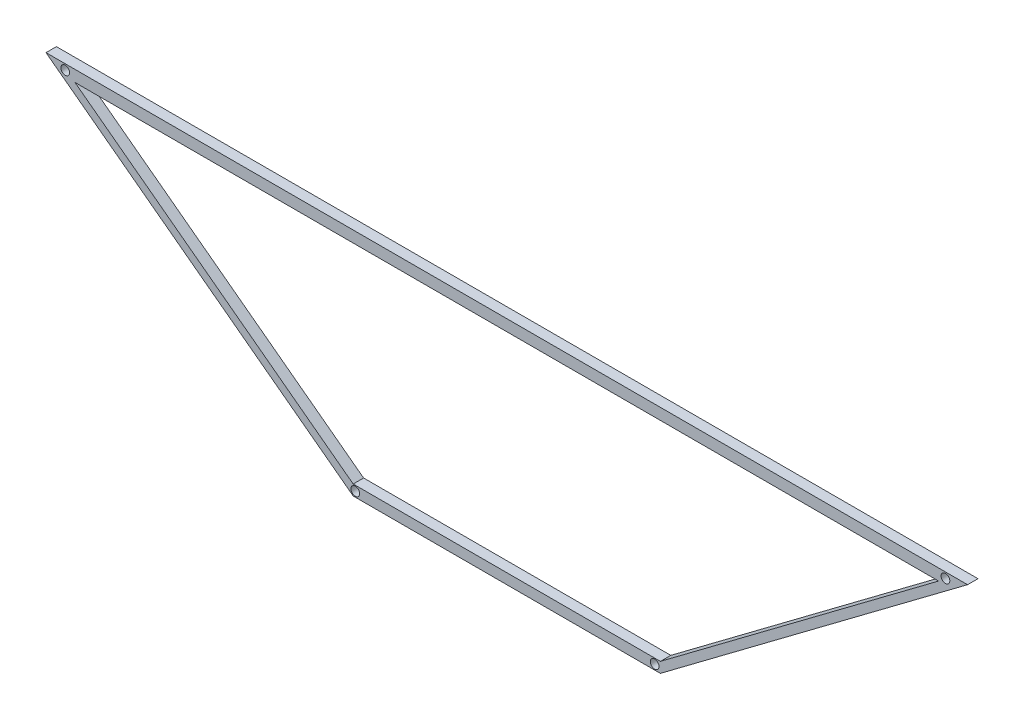
ISO-10303-21;
HEADER;
FILE_DESCRIPTION(('STEP AP214'),'2;1');
FILE_NAME('part.step','',(''),(''),'','','');
FILE_SCHEMA(('AUTOMOTIVE_DESIGN { 1 0 10303 214 1 1 1 1 }'));
ENDSEC;
DATA;
#1=APPLICATION_CONTEXT('core data for automotive mechanical design processes');
#2=APPLICATION_PROTOCOL_DEFINITION('international standard','automotive_design',2000,#1);
#3=PRODUCT_CONTEXT('',#1,'mechanical');
#4=PRODUCT('Part','Part','',(#3));
#5=PRODUCT_RELATED_PRODUCT_CATEGORY('part','',(#4));
#6=PRODUCT_DEFINITION_FORMATION('','',#4);
#7=PRODUCT_DEFINITION_CONTEXT('part definition',#1,'design');
#8=PRODUCT_DEFINITION('design','',#6,#7);
#9=PRODUCT_DEFINITION_SHAPE('','',#8);
#10=(LENGTH_UNIT() NAMED_UNIT(*) SI_UNIT(.MILLI.,.METRE.));
#11=(NAMED_UNIT(*) PLANE_ANGLE_UNIT() SI_UNIT($,.RADIAN.));
#12=(NAMED_UNIT(*) SI_UNIT($,.STERADIAN.) SOLID_ANGLE_UNIT());
#13=UNCERTAINTY_MEASURE_WITH_UNIT(LENGTH_MEASURE(1.E-05),#10,'distance_accuracy_value','');
#14=(GEOMETRIC_REPRESENTATION_CONTEXT(3) GLOBAL_UNCERTAINTY_ASSIGNED_CONTEXT((#13)) GLOBAL_UNIT_ASSIGNED_CONTEXT((#10,
#11,#12)) REPRESENTATION_CONTEXT('',''));
#15=CARTESIAN_POINT('',(0.,0.,0.));
#16=DIRECTION('',(0.,0.,1.));
#17=DIRECTION('',(1.,0.,0.));
#18=AXIS2_PLACEMENT_3D('',#15,#16,#17);
#19=CARTESIAN_POINT('',(0.,0.,13.56));
#20=DIRECTION('',(0.,0.,-1.));
#21=DIRECTION('',(-1.,0.,0.));
#22=AXIS2_PLACEMENT_3D('',#19,#20,#21);
#23=PLANE('',#22);
#24=CARTESIAN_POINT('',(945.339868666451,62.77782,13.56));
#25=DIRECTION('',(0.,0.,1.));
#26=DIRECTION('',(1.,0.,0.));
#27=AXIS2_PLACEMENT_3D('',#24,#25,#26);
#28=CIRCLE('',#27,5.70000000000006);
#29=CARTESIAN_POINT('',(951.039868666451,62.77782,13.56));
#30=VERTEX_POINT('',#29);
#31=EDGE_CURVE('E272',#30,#30,#28,.T.);
#32=ORIENTED_EDGE('',*,*,#31,.F.);
#33=EDGE_LOOP('',(#32));
#34=FACE_BOUND('',#33,.T.);
#35=CARTESIAN_POINT('',(-200.789433703648,62.77782,13.56));
#36=DIRECTION('',(0.,0.,1.));
#37=DIRECTION('',(1.,0.,0.));
#38=AXIS2_PLACEMENT_3D('',#35,#36,#37);
#39=CIRCLE('',#38,5.7);
#40=CARTESIAN_POINT('',(-195.089433703648,62.77782,13.56));
#41=VERTEX_POINT('',#40);
#42=EDGE_CURVE('E274',#41,#41,#39,.T.);
#43=ORIENTED_EDGE('',*,*,#42,.F.);
#44=EDGE_LOOP('',(#43));
#45=FACE_BOUND('',#44,.T.);
#46=CARTESIAN_POINT('',(176.919160889639,-223.073008715588,13.56));
#47=DIRECTION('',(0.,0.,1.));
#48=DIRECTION('',(1.,0.,0.));
#49=AXIS2_PLACEMENT_3D('',#46,#47,#48);
#50=CIRCLE('',#49,5.70000000000001);
#51=CARTESIAN_POINT('',(182.619160889639,-223.073008715588,13.56));
#52=VERTEX_POINT('',#51);
#53=EDGE_CURVE('E289',#52,#52,#50,.T.);
#54=ORIENTED_EDGE('',*,*,#53,.F.);
#55=EDGE_LOOP('',(#54));
#56=FACE_BOUND('',#55,.T.);
#57=CARTESIAN_POINT('',(566.674885296607,-223.073008715588,13.56));
#58=DIRECTION('',(0.,0.,1.));
#59=DIRECTION('',(1.,0.,0.));
#60=AXIS2_PLACEMENT_3D('',#57,#58,#59);
#61=CIRCLE('',#60,5.70000000000006);
#62=CARTESIAN_POINT('',(572.374885296607,-223.073008715588,13.56));
#63=VERTEX_POINT('',#62);
#64=EDGE_CURVE('E293',#63,#63,#61,.T.);
#65=ORIENTED_EDGE('',*,*,#64,.F.);
#66=EDGE_LOOP('',(#65));
#67=FACE_BOUND('',#66,.T.);
#68=DIRECTION('',(0.8,-0.6,0.));
#69=VECTOR('',#68,1.);
#70=CARTESIAN_POINT('',(-225.816062759579,70.095146263553,13.56));
#71=LINE('',#70,#69);
#72=CARTESIAN_POINT('',(-225.816062759579,70.095146263553,13.56));
#73=VERTEX_POINT('',#72);
#74=CARTESIAN_POINT('',(174.183937240421,-229.904853736447,13.56));
#75=VERTEX_POINT('',#74);
#76=EDGE_CURVE('E161',#73,#75,#71,.T.);
#77=ORIENTED_EDGE('',*,*,#76,.T.);
#78=DIRECTION('',(1.,0.,0.));
#79=VECTOR('',#78,1.);
#80=CARTESIAN_POINT('',(174.183937240421,-229.904853736447,13.56));
#81=LINE('',#80,#79);
#82=CARTESIAN_POINT('',(574.183937240421,-229.904853736447,13.56));
#83=VERTEX_POINT('',#82);
#84=EDGE_CURVE('E164',#75,#83,#81,.T.);
#85=ORIENTED_EDGE('',*,*,#84,.T.);
#86=DIRECTION('',(0.8,0.6,0.));
#87=VECTOR('',#86,1.);
#88=CARTESIAN_POINT('',(974.183937240421,70.095146263553,13.56));
#89=LINE('',#88,#87);
#90=CARTESIAN_POINT('',(974.183937240421,70.095146263553,13.56));
#91=VERTEX_POINT('',#90);
#92=EDGE_CURVE('E166',#83,#91,#89,.T.);
#93=ORIENTED_EDGE('',*,*,#92,.T.);
#94=DIRECTION('',(-1.,0.,0.));
#95=VECTOR('',#94,1.);
#96=CARTESIAN_POINT('',(-225.816062759579,70.095146263553,13.56));
#97=LINE('',#96,#95);
#98=EDGE_CURVE('E171',#91,#73,#97,.T.);
#99=ORIENTED_EDGE('',*,*,#98,.T.);
#100=EDGE_LOOP('',(#77,#85,#93,#99));
#101=FACE_BOUND('',#100,.T.);
#102=DIRECTION('',(-1.,0.,0.));
#103=VECTOR('',#102,1.);
#104=CARTESIAN_POINT('',(936.447387253727,55.3527337735328,13.56));
#105=LINE('',#104,#103);
#106=CARTESIAN_POINT('',(936.447387253727,55.3527337735328,13.56));
#107=VERTEX_POINT('',#106);
#108=CARTESIAN_POINT('',(-188.079512772886,55.3527337735327,13.56));
#109=VERTEX_POINT('',#108);
#110=EDGE_CURVE('E112',#107,#109,#105,.T.);
#111=ORIENTED_EDGE('',*,*,#110,.F.);
#112=DIRECTION('',(0.8,0.6,0.));
#113=VECTOR('',#112,1.);
#114=CARTESIAN_POINT('',(574.183937240421,-216.344853736447,13.56));
#115=LINE('',#114,#113);
#116=CARTESIAN_POINT('',(574.183937240421,-216.344853736447,13.56));
#117=VERTEX_POINT('',#116);
#118=EDGE_CURVE('E139',#117,#107,#115,.T.);
#119=ORIENTED_EDGE('',*,*,#118,.F.);
#120=DIRECTION('',(1.,0.,0.));
#121=VECTOR('',#120,1.);
#122=CARTESIAN_POINT('',(174.183937240421,-216.344853736447,13.56));
#123=LINE('',#122,#121);
#124=CARTESIAN_POINT('',(174.183937240421,-216.344853736447,13.56));
#125=VERTEX_POINT('',#124);
#126=EDGE_CURVE('E134',#125,#117,#123,.T.);
#127=ORIENTED_EDGE('',*,*,#126,.F.);
#128=DIRECTION('',(0.8,-0.6,0.));
#129=VECTOR('',#128,1.);
#130=CARTESIAN_POINT('',(174.183937240421,-216.344853736447,13.56));
#131=LINE('',#130,#129);
#132=EDGE_CURVE('E117',#109,#125,#131,.T.);
#133=ORIENTED_EDGE('',*,*,#132,.F.);
#134=EDGE_LOOP('',(#111,#119,#127,#133));
#135=FACE_BOUND('',#134,.T.);
#136=ADVANCED_FACE('F44',(#34,#45,#56,#67,#101,#135),#23,.F.);
#137=CARTESIAN_POINT('',(0.,0.,0.));
#138=DIRECTION('',(0.,0.,-1.));
#139=DIRECTION('',(-1.,0.,0.));
#140=AXIS2_PLACEMENT_3D('',#137,#138,#139);
#141=PLANE('',#140);
#142=CARTESIAN_POINT('',(945.339868666451,62.77782,0.));
#143=DIRECTION('',(0.,0.,1.));
#144=DIRECTION('',(1.,0.,0.));
#145=AXIS2_PLACEMENT_3D('',#142,#143,#144);
#146=CIRCLE('',#145,5.70000000000006);
#147=CARTESIAN_POINT('',(951.039868666451,62.77782,0.));
#148=VERTEX_POINT('',#147);
#149=EDGE_CURVE('E144',#148,#148,#146,.T.);
#150=ORIENTED_EDGE('',*,*,#149,.T.);
#151=EDGE_LOOP('',(#150));
#152=FACE_BOUND('',#151,.T.);
#153=CARTESIAN_POINT('',(-200.789433703648,62.77782,0.));
#154=DIRECTION('',(0.,0.,1.));
#155=DIRECTION('',(1.,0.,0.));
#156=AXIS2_PLACEMENT_3D('',#153,#154,#155);
#157=CIRCLE('',#156,5.7);
#158=CARTESIAN_POINT('',(-195.089433703648,62.77782,0.));
#159=VERTEX_POINT('',#158);
#160=EDGE_CURVE('E284',#159,#159,#157,.T.);
#161=ORIENTED_EDGE('',*,*,#160,.T.);
#162=EDGE_LOOP('',(#161));
#163=FACE_BOUND('',#162,.T.);
#164=CARTESIAN_POINT('',(176.919160889639,-223.073008715588,0.));
#165=DIRECTION('',(0.,0.,1.));
#166=DIRECTION('',(1.,0.,0.));
#167=AXIS2_PLACEMENT_3D('',#164,#165,#166);
#168=CIRCLE('',#167,5.70000000000001);
#169=CARTESIAN_POINT('',(182.619160889639,-223.073008715588,0.));
#170=VERTEX_POINT('',#169);
#171=EDGE_CURVE('E292',#170,#170,#168,.T.);
#172=ORIENTED_EDGE('',*,*,#171,.T.);
#173=EDGE_LOOP('',(#172));
#174=FACE_BOUND('',#173,.T.);
#175=CARTESIAN_POINT('',(566.674885296607,-223.073008715588,0.));
#176=DIRECTION('',(0.,0.,1.));
#177=DIRECTION('',(1.,0.,0.));
#178=AXIS2_PLACEMENT_3D('',#175,#176,#177);
#179=CIRCLE('',#178,5.70000000000006);
#180=CARTESIAN_POINT('',(572.374885296607,-223.073008715588,0.));
#181=VERTEX_POINT('',#180);
#182=EDGE_CURVE('E299',#181,#181,#179,.T.);
#183=ORIENTED_EDGE('',*,*,#182,.T.);
#184=EDGE_LOOP('',(#183));
#185=FACE_BOUND('',#184,.T.);
#186=DIRECTION('',(0.8,-0.6,0.));
#187=VECTOR('',#186,1.);
#188=CARTESIAN_POINT('',(-225.816062759579,70.095146263553,0.));
#189=LINE('',#188,#187);
#190=CARTESIAN_POINT('',(-225.816062759579,70.095146263553,0.));
#191=VERTEX_POINT('',#190);
#192=CARTESIAN_POINT('',(174.183937240421,-229.904853736447,0.));
#193=VERTEX_POINT('',#192);
#194=EDGE_CURVE('E129',#191,#193,#189,.T.);
#195=ORIENTED_EDGE('',*,*,#194,.F.);
#196=DIRECTION('',(-1.,0.,0.));
#197=VECTOR('',#196,1.);
#198=CARTESIAN_POINT('',(-225.816062759579,70.095146263553,0.));
#199=LINE('',#198,#197);
#200=CARTESIAN_POINT('',(974.183937240421,70.095146263553,0.));
#201=VERTEX_POINT('',#200);
#202=EDGE_CURVE('E167',#201,#191,#199,.T.);
#203=ORIENTED_EDGE('',*,*,#202,.F.);
#204=DIRECTION('',(0.8,0.6,0.));
#205=VECTOR('',#204,1.);
#206=CARTESIAN_POINT('',(974.183937240421,70.095146263553,0.));
#207=LINE('',#206,#205);
#208=CARTESIAN_POINT('',(574.183937240421,-229.904853736447,0.));
#209=VERTEX_POINT('',#208);
#210=EDGE_CURVE('E185',#209,#201,#207,.T.);
#211=ORIENTED_EDGE('',*,*,#210,.F.);
#212=DIRECTION('',(1.,0.,0.));
#213=VECTOR('',#212,1.);
#214=CARTESIAN_POINT('',(174.183937240421,-229.904853736447,0.));
#215=LINE('',#214,#213);
#216=EDGE_CURVE('E180',#193,#209,#215,.T.);
#217=ORIENTED_EDGE('',*,*,#216,.F.);
#218=EDGE_LOOP('',(#195,#203,#211,#217));
#219=FACE_BOUND('',#218,.T.);
#220=DIRECTION('',(0.8,0.6,0.));
#221=VECTOR('',#220,1.);
#222=CARTESIAN_POINT('',(574.183937240421,-216.344853736447,0.));
#223=LINE('',#222,#221);
#224=CARTESIAN_POINT('',(574.183937240421,-216.344853736447,0.));
#225=VERTEX_POINT('',#224);
#226=CARTESIAN_POINT('',(936.447387253727,55.3527337735329,0.));
#227=VERTEX_POINT('',#226);
#228=EDGE_CURVE('E123',#225,#227,#223,.T.);
#229=ORIENTED_EDGE('',*,*,#228,.T.);
#230=DIRECTION('',(-1.,0.,0.));
#231=VECTOR('',#230,1.);
#232=CARTESIAN_POINT('',(936.447387253727,55.3527337735328,0.));
#233=LINE('',#232,#231);
#234=CARTESIAN_POINT('',(-188.079512772886,55.3527337735327,0.));
#235=VERTEX_POINT('',#234);
#236=EDGE_CURVE('E70',#227,#235,#233,.T.);
#237=ORIENTED_EDGE('',*,*,#236,.T.);
#238=DIRECTION('',(0.8,-0.6,0.));
#239=VECTOR('',#238,1.);
#240=CARTESIAN_POINT('',(174.183937240421,-216.344853736447,0.));
#241=LINE('',#240,#239);
#242=CARTESIAN_POINT('',(174.183937240421,-216.344853736447,0.));
#243=VERTEX_POINT('',#242);
#244=EDGE_CURVE('E130',#235,#243,#241,.T.);
#245=ORIENTED_EDGE('',*,*,#244,.T.);
#246=DIRECTION('',(1.,0.,0.));
#247=VECTOR('',#246,1.);
#248=CARTESIAN_POINT('',(174.183937240421,-216.344853736447,0.));
#249=LINE('',#248,#247);
#250=EDGE_CURVE('E146',#243,#225,#249,.T.);
#251=ORIENTED_EDGE('',*,*,#250,.T.);
#252=EDGE_LOOP('',(#229,#237,#245,#251));
#253=FACE_BOUND('',#252,.T.);
#254=ADVANCED_FACE('F202',(#152,#163,#174,#185,#219,#253),#141,.T.);
#255=CARTESIAN_POINT('',(-225.816062759579,70.095146263553,13.56));
#256=DIRECTION('',(0.6,0.8,0.));
#257=DIRECTION('',(-0.8,0.6,0.));
#258=AXIS2_PLACEMENT_3D('',#255,#256,#257);
#259=PLANE('',#258);
#260=ORIENTED_EDGE('',*,*,#194,.T.);
#261=DIRECTION('',(0.,0.,-1.));
#262=VECTOR('',#261,1.);
#263=CARTESIAN_POINT('',(174.183937240421,-229.904853736447,13.56));
#264=LINE('',#263,#262);
#265=EDGE_CURVE('E11',#75,#193,#264,.T.);
#266=ORIENTED_EDGE('',*,*,#265,.F.);
#267=ORIENTED_EDGE('',*,*,#76,.F.);
#268=DIRECTION('',(0.,0.,-1.));
#269=VECTOR('',#268,1.);
#270=CARTESIAN_POINT('',(-225.816062759579,70.095146263553,13.56));
#271=LINE('',#270,#269);
#272=EDGE_CURVE('E172',#73,#191,#271,.T.);
#273=ORIENTED_EDGE('',*,*,#272,.T.);
#274=EDGE_LOOP('',(#260,#266,#267,#273));
#275=FACE_BOUND('',#274,.T.);
#276=ADVANCED_FACE('F50',(#275),#259,.F.);
#277=CARTESIAN_POINT('',(174.183937240421,-229.904853736447,13.56));
#278=DIRECTION('',(0.,1.,0.));
#279=DIRECTION('',(0.,0.,1.));
#280=AXIS2_PLACEMENT_3D('',#277,#278,#279);
#281=PLANE('',#280);
#282=ORIENTED_EDGE('',*,*,#216,.T.);
#283=DIRECTION('',(0.,0.,-1.));
#284=VECTOR('',#283,1.);
#285=CARTESIAN_POINT('',(574.183937240421,-229.904853736447,13.56));
#286=LINE('',#285,#284);
#287=EDGE_CURVE('E53',#83,#209,#286,.T.);
#288=ORIENTED_EDGE('',*,*,#287,.F.);
#289=ORIENTED_EDGE('',*,*,#84,.F.);
#290=ORIENTED_EDGE('',*,*,#265,.T.);
#291=EDGE_LOOP('',(#282,#288,#289,#290));
#292=FACE_BOUND('',#291,.T.);
#293=ADVANCED_FACE('F214',(#292),#281,.F.);
#294=CARTESIAN_POINT('',(974.183937240421,70.095146263553,13.56));
#295=DIRECTION('',(-0.6,0.8,0.));
#296=DIRECTION('',(-0.8,-0.6,0.));
#297=AXIS2_PLACEMENT_3D('',#294,#295,#296);
#298=PLANE('',#297);
#299=ORIENTED_EDGE('',*,*,#210,.T.);
#300=DIRECTION('',(0.,0.,-1.));
#301=VECTOR('',#300,1.);
#302=CARTESIAN_POINT('',(974.183937240421,70.095146263553,13.56));
#303=LINE('',#302,#301);
#304=EDGE_CURVE('E188',#91,#201,#303,.T.);
#305=ORIENTED_EDGE('',*,*,#304,.F.);
#306=ORIENTED_EDGE('',*,*,#92,.F.);
#307=ORIENTED_EDGE('',*,*,#287,.T.);
#308=EDGE_LOOP('',(#299,#305,#306,#307));
#309=FACE_BOUND('',#308,.T.);
#310=ADVANCED_FACE('F200',(#309),#298,.F.);
#311=CARTESIAN_POINT('',(-225.816062759579,70.095146263553,13.56));
#312=DIRECTION('',(0.,-1.,0.));
#313=DIRECTION('',(0.,0.,-1.));
#314=AXIS2_PLACEMENT_3D('',#311,#312,#313);
#315=PLANE('',#314);
#316=ORIENTED_EDGE('',*,*,#202,.T.);
#317=ORIENTED_EDGE('',*,*,#272,.F.);
#318=ORIENTED_EDGE('',*,*,#98,.F.);
#319=ORIENTED_EDGE('',*,*,#304,.T.);
#320=EDGE_LOOP('',(#316,#317,#318,#319));
#321=FACE_BOUND('',#320,.T.);
#322=ADVANCED_FACE('F207',(#321),#315,.F.);
#323=CARTESIAN_POINT('',(936.447387253727,55.3527337735328,13.56));
#324=DIRECTION('',(0.,-1.,0.));
#325=DIRECTION('',(1.,0.,0.));
#326=AXIS2_PLACEMENT_3D('',#323,#324,#325);
#327=PLANE('',#326);
#328=ORIENTED_EDGE('',*,*,#236,.F.);
#329=DIRECTION('',(0.,0.,-1.));
#330=VECTOR('',#329,1.);
#331=CARTESIAN_POINT('',(936.447387253727,55.3527337735328,13.56));
#332=LINE('',#331,#330);
#333=EDGE_CURVE('E113',#107,#227,#332,.T.);
#334=ORIENTED_EDGE('',*,*,#333,.F.);
#335=ORIENTED_EDGE('',*,*,#110,.T.);
#336=DIRECTION('',(0.,0.,-1.));
#337=VECTOR('',#336,1.);
#338=CARTESIAN_POINT('',(-188.079512772886,55.3527337735327,13.56));
#339=LINE('',#338,#337);
#340=EDGE_CURVE('E111',#109,#235,#339,.T.);
#341=ORIENTED_EDGE('',*,*,#340,.T.);
#342=EDGE_LOOP('',(#328,#334,#335,#341));
#343=FACE_BOUND('',#342,.T.);
#344=ADVANCED_FACE('F114',(#343),#327,.T.);
#345=CARTESIAN_POINT('',(174.183937240421,-216.344853736447,13.56));
#346=DIRECTION('',(0.6,0.8,0.));
#347=DIRECTION('',(-0.8,0.6,0.));
#348=AXIS2_PLACEMENT_3D('',#345,#346,#347);
#349=PLANE('',#348);
#350=ORIENTED_EDGE('',*,*,#244,.F.);
#351=ORIENTED_EDGE('',*,*,#340,.F.);
#352=ORIENTED_EDGE('',*,*,#132,.T.);
#353=DIRECTION('',(0.,0.,-1.));
#354=VECTOR('',#353,1.);
#355=CARTESIAN_POINT('',(174.183937240421,-216.344853736447,13.56));
#356=LINE('',#355,#354);
#357=EDGE_CURVE('E128',#125,#243,#356,.T.);
#358=ORIENTED_EDGE('',*,*,#357,.T.);
#359=EDGE_LOOP('',(#350,#351,#352,#358));
#360=FACE_BOUND('',#359,.T.);
#361=ADVANCED_FACE('F125',(#360),#349,.T.);
#362=CARTESIAN_POINT('',(174.183937240421,-216.344853736447,13.56));
#363=DIRECTION('',(0.,1.,0.));
#364=DIRECTION('',(0.,0.,1.));
#365=AXIS2_PLACEMENT_3D('',#362,#363,#364);
#366=PLANE('',#365);
#367=ORIENTED_EDGE('',*,*,#250,.F.);
#368=ORIENTED_EDGE('',*,*,#357,.F.);
#369=ORIENTED_EDGE('',*,*,#126,.T.);
#370=DIRECTION('',(0.,0.,-1.));
#371=VECTOR('',#370,1.);
#372=CARTESIAN_POINT('',(574.183937240421,-216.344853736447,13.56));
#373=LINE('',#372,#371);
#374=EDGE_CURVE('E64',#117,#225,#373,.T.);
#375=ORIENTED_EDGE('',*,*,#374,.T.);
#376=EDGE_LOOP('',(#367,#368,#369,#375));
#377=FACE_BOUND('',#376,.T.);
#378=ADVANCED_FACE('F244',(#377),#366,.T.);
#379=CARTESIAN_POINT('',(574.183937240421,-216.344853736447,13.56));
#380=DIRECTION('',(-0.6,0.8,0.));
#381=DIRECTION('',(-0.8,-0.6,0.));
#382=AXIS2_PLACEMENT_3D('',#379,#380,#381);
#383=PLANE('',#382);
#384=ORIENTED_EDGE('',*,*,#228,.F.);
#385=ORIENTED_EDGE('',*,*,#374,.F.);
#386=ORIENTED_EDGE('',*,*,#118,.T.);
#387=ORIENTED_EDGE('',*,*,#333,.T.);
#388=EDGE_LOOP('',(#384,#385,#386,#387));
#389=FACE_BOUND('',#388,.T.);
#390=ADVANCED_FACE('F249',(#389),#383,.T.);
#391=CARTESIAN_POINT('',(566.674885296607,-223.073008715588,0.));
#392=DIRECTION('',(0.,0.,1.));
#393=DIRECTION('',(1.,0.,0.));
#394=AXIS2_PLACEMENT_3D('',#391,#392,#393);
#395=CYLINDRICAL_SURFACE('',#394,5.70000000000006);
#396=ORIENTED_EDGE('',*,*,#182,.F.);
#397=EDGE_LOOP('',(#396));
#398=FACE_BOUND('',#397,.T.);
#399=ORIENTED_EDGE('',*,*,#64,.T.);
#400=EDGE_LOOP('',(#399));
#401=FACE_BOUND('',#400,.T.);
#402=ADVANCED_FACE('F252',(#398,#401),#395,.F.);
#403=CARTESIAN_POINT('',(176.919160889639,-223.073008715588,0.));
#404=DIRECTION('',(0.,0.,1.));
#405=DIRECTION('',(1.,0.,0.));
#406=AXIS2_PLACEMENT_3D('',#403,#404,#405);
#407=CYLINDRICAL_SURFACE('',#406,5.70000000000001);
#408=ORIENTED_EDGE('',*,*,#171,.F.);
#409=EDGE_LOOP('',(#408));
#410=FACE_BOUND('',#409,.T.);
#411=ORIENTED_EDGE('',*,*,#53,.T.);
#412=EDGE_LOOP('',(#411));
#413=FACE_BOUND('',#412,.T.);
#414=ADVANCED_FACE('F254',(#410,#413),#407,.F.);
#415=CARTESIAN_POINT('',(-200.789433703648,62.77782,0.));
#416=DIRECTION('',(0.,0.,1.));
#417=DIRECTION('',(1.,0.,0.));
#418=AXIS2_PLACEMENT_3D('',#415,#416,#417);
#419=CYLINDRICAL_SURFACE('',#418,5.7);
#420=ORIENTED_EDGE('',*,*,#160,.F.);
#421=EDGE_LOOP('',(#420));
#422=FACE_BOUND('',#421,.T.);
#423=ORIENTED_EDGE('',*,*,#42,.T.);
#424=EDGE_LOOP('',(#423));
#425=FACE_BOUND('',#424,.T.);
#426=ADVANCED_FACE('F259',(#422,#425),#419,.F.);
#427=CARTESIAN_POINT('',(945.339868666451,62.77782,0.));
#428=DIRECTION('',(0.,0.,1.));
#429=DIRECTION('',(1.,0.,0.));
#430=AXIS2_PLACEMENT_3D('',#427,#428,#429);
#431=CYLINDRICAL_SURFACE('',#430,5.70000000000006);
#432=ORIENTED_EDGE('',*,*,#149,.F.);
#433=EDGE_LOOP('',(#432));
#434=FACE_BOUND('',#433,.T.);
#435=ORIENTED_EDGE('',*,*,#31,.T.);
#436=EDGE_LOOP('',(#435));
#437=FACE_BOUND('',#436,.T.);
#438=ADVANCED_FACE('F263',(#434,#437),#431,.F.);
#439=CLOSED_SHELL('',(#136,#254,#276,#293,#310,#322,#344,#361,#378,#390,#402,#414,#426,#438));
#440=MANIFOLD_SOLID_BREP('B2',#439);
#441=ADVANCED_BREP_SHAPE_REPRESENTATION('',(#18,#440),#14);
#442=SHAPE_DEFINITION_REPRESENTATION(#9,#441);
ENDSEC;
END-ISO-10303-21;
